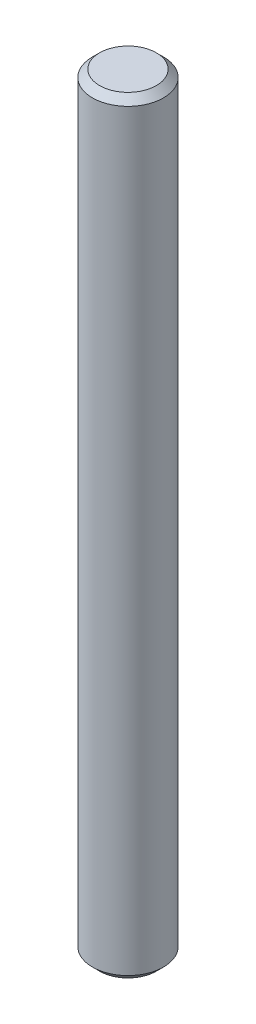
ISO-10303-21;
HEADER;
FILE_DESCRIPTION(('STEP AP214'),'2;1');
FILE_NAME('part.step','',(''),(''),'','','');
FILE_SCHEMA(('AUTOMOTIVE_DESIGN { 1 0 10303 214 1 1 1 1 }'));
ENDSEC;
DATA;
#1=APPLICATION_CONTEXT('core data for automotive mechanical design processes');
#2=APPLICATION_PROTOCOL_DEFINITION('international standard','automotive_design',2000,#1);
#3=PRODUCT_CONTEXT('',#1,'mechanical');
#4=PRODUCT('Part','Part','',(#3));
#5=PRODUCT_RELATED_PRODUCT_CATEGORY('part','',(#4));
#6=PRODUCT_DEFINITION_FORMATION('','',#4);
#7=PRODUCT_DEFINITION_CONTEXT('part definition',#1,'design');
#8=PRODUCT_DEFINITION('design','',#6,#7);
#9=PRODUCT_DEFINITION_SHAPE('','',#8);
#10=(LENGTH_UNIT() NAMED_UNIT(*) SI_UNIT(.MILLI.,.METRE.));
#11=(NAMED_UNIT(*) PLANE_ANGLE_UNIT() SI_UNIT($,.RADIAN.));
#12=(NAMED_UNIT(*) SI_UNIT($,.STERADIAN.) SOLID_ANGLE_UNIT());
#13=UNCERTAINTY_MEASURE_WITH_UNIT(LENGTH_MEASURE(1.E-05),#10,'distance_accuracy_value','');
#14=(GEOMETRIC_REPRESENTATION_CONTEXT(3) GLOBAL_UNCERTAINTY_ASSIGNED_CONTEXT((#13)) GLOBAL_UNIT_ASSIGNED_CONTEXT((#10,
#11,#12)) REPRESENTATION_CONTEXT('',''));
#15=CARTESIAN_POINT('',(0.,0.,0.));
#16=DIRECTION('',(0.,0.,1.));
#17=DIRECTION('',(1.,0.,0.));
#18=AXIS2_PLACEMENT_3D('',#15,#16,#17);
#19=CARTESIAN_POINT('',(0.,54.,0.));
#20=DIRECTION('',(0.,-1.,0.));
#21=DIRECTION('',(1.,0.,0.));
#22=AXIS2_PLACEMENT_3D('',#19,#20,#21);
#23=PLANE('',#22);
#24=CARTESIAN_POINT('',(0.,54.,0.));
#25=DIRECTION('',(0.,-1.,0.));
#26=DIRECTION('',(1.,0.,0.));
#27=AXIS2_PLACEMENT_3D('',#24,#25,#26);
#28=CIRCLE('',#27,4.00000000000002);
#29=CARTESIAN_POINT('',(4.,54.,0.));
#30=VERTEX_POINT('',#29);
#31=EDGE_CURVE('E10',#30,#30,#28,.F.);
#32=ORIENTED_EDGE('',*,*,#31,.T.);
#33=EDGE_LOOP('',(#32));
#34=FACE_BOUND('',#33,.T.);
#35=ADVANCED_FACE('F35',(#34),#23,.F.);
#36=CARTESIAN_POINT('',(0.,54.,0.));
#37=DIRECTION('',(0.,1.,0.));
#38=DIRECTION('',(-1.,0.,0.));
#39=AXIS2_PLACEMENT_3D('',#36,#37,#38);
#40=CYLINDRICAL_SURFACE('',#39,5.00000000000001);
#41=CARTESIAN_POINT('',(0.,-53.0000000000001,0.));
#42=DIRECTION('',(0.,1.,0.));
#43=DIRECTION('',(-1.,0.,0.));
#44=AXIS2_PLACEMENT_3D('',#41,#42,#43);
#45=CIRCLE('',#44,5.00000000000001);
#46=CARTESIAN_POINT('',(-5.,-53.0000000000001,0.));
#47=VERTEX_POINT('',#46);
#48=EDGE_CURVE('E47',#47,#47,#45,.T.);
#49=ORIENTED_EDGE('',*,*,#48,.T.);
#50=EDGE_LOOP('',(#49));
#51=FACE_BOUND('',#50,.T.);
#52=CARTESIAN_POINT('',(0.,53.,0.));
#53=DIRECTION('',(0.,-1.,0.));
#54=DIRECTION('',(1.,0.,0.));
#55=AXIS2_PLACEMENT_3D('',#52,#53,#54);
#56=CIRCLE('',#55,5.00000000000001);
#57=CARTESIAN_POINT('',(4.99999999999999,53.,0.));
#58=VERTEX_POINT('',#57);
#59=EDGE_CURVE('E51',#58,#58,#56,.T.);
#60=ORIENTED_EDGE('',*,*,#59,.T.);
#61=EDGE_LOOP('',(#60));
#62=FACE_BOUND('',#61,.T.);
#63=ADVANCED_FACE('F57',(#51,#62),#40,.T.);
#64=CARTESIAN_POINT('',(5.00000000000002,-54.,0.));
#65=DIRECTION('',(0.,1.,0.));
#66=DIRECTION('',(-1.,0.,0.));
#67=AXIS2_PLACEMENT_3D('',#64,#65,#66);
#68=PLANE('',#67);
#69=CARTESIAN_POINT('',(0.,-54.,0.));
#70=DIRECTION('',(0.,1.,0.));
#71=DIRECTION('',(-1.,0.,0.));
#72=AXIS2_PLACEMENT_3D('',#69,#70,#71);
#73=CIRCLE('',#72,4.00000000000009);
#74=CARTESIAN_POINT('',(-4.00000000000008,-54.,0.));
#75=VERTEX_POINT('',#74);
#76=EDGE_CURVE('E43',#75,#75,#73,.F.);
#77=ORIENTED_EDGE('',*,*,#76,.T.);
#78=EDGE_LOOP('',(#77));
#79=FACE_BOUND('',#78,.T.);
#80=ADVANCED_FACE('F65',(#79),#68,.F.);
#81=CARTESIAN_POINT('',(0.,-53.0000000000001,0.));
#82=DIRECTION('',(0.,1.,0.));
#83=DIRECTION('',(-1.,0.,0.));
#84=AXIS2_PLACEMENT_3D('',#81,#82,#83);
#85=CONICAL_SURFACE('',#84,5.00000000000001,0.785398163397457);
#86=ORIENTED_EDGE('',*,*,#76,.F.);
#87=EDGE_LOOP('',(#86));
#88=FACE_BOUND('',#87,.T.);
#89=ORIENTED_EDGE('',*,*,#48,.F.);
#90=EDGE_LOOP('',(#89));
#91=FACE_BOUND('',#90,.T.);
#92=ADVANCED_FACE('F61',(#88,#91),#85,.T.);
#93=CARTESIAN_POINT('',(0.,54.,0.));
#94=DIRECTION('',(0.,-1.,0.));
#95=DIRECTION('',(1.,0.,0.));
#96=AXIS2_PLACEMENT_3D('',#93,#94,#95);
#97=CONICAL_SURFACE('',#96,4.00000000000002,0.785398163397447);
#98=ORIENTED_EDGE('',*,*,#59,.F.);
#99=EDGE_LOOP('',(#98));
#100=FACE_BOUND('',#99,.T.);
#101=ORIENTED_EDGE('',*,*,#31,.F.);
#102=EDGE_LOOP('',(#101));
#103=FACE_BOUND('',#102,.T.);
#104=ADVANCED_FACE('F38',(#100,#103),#97,.T.);
#105=CLOSED_SHELL('',(#35,#63,#80,#92,#104));
#106=MANIFOLD_SOLID_BREP('B2',#105);
#107=ADVANCED_BREP_SHAPE_REPRESENTATION('',(#18,#106),#14);
#108=SHAPE_DEFINITION_REPRESENTATION(#9,#107);
ENDSEC;
END-ISO-10303-21;
